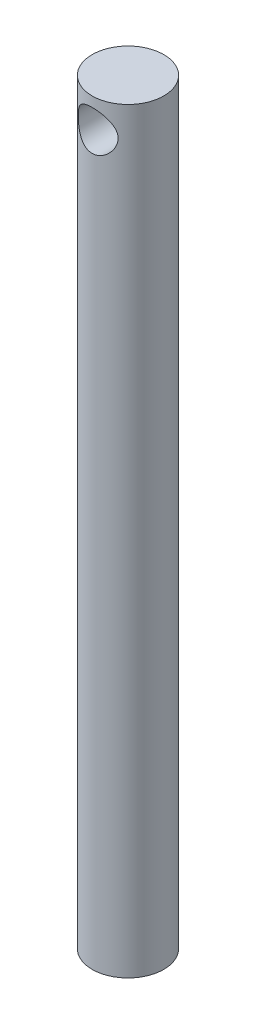
ISO-10303-21;
HEADER;
FILE_DESCRIPTION(('STEP AP214'),'2;1');
FILE_NAME('part.step','',(''),(''),'','','');
FILE_SCHEMA(('AUTOMOTIVE_DESIGN { 1 0 10303 214 1 1 1 1 }'));
ENDSEC;
DATA;
#1=APPLICATION_CONTEXT('core data for automotive mechanical design processes');
#2=APPLICATION_PROTOCOL_DEFINITION('international standard','automotive_design',2000,#1);
#3=PRODUCT_CONTEXT('',#1,'mechanical');
#4=PRODUCT('Part','Part','',(#3));
#5=PRODUCT_RELATED_PRODUCT_CATEGORY('part','',(#4));
#6=PRODUCT_DEFINITION_FORMATION('','',#4);
#7=PRODUCT_DEFINITION_CONTEXT('part definition',#1,'design');
#8=PRODUCT_DEFINITION('design','',#6,#7);
#9=PRODUCT_DEFINITION_SHAPE('','',#8);
#10=(LENGTH_UNIT() NAMED_UNIT(*) SI_UNIT(.MILLI.,.METRE.));
#11=(NAMED_UNIT(*) PLANE_ANGLE_UNIT() SI_UNIT($,.RADIAN.));
#12=(NAMED_UNIT(*) SI_UNIT($,.STERADIAN.) SOLID_ANGLE_UNIT());
#13=UNCERTAINTY_MEASURE_WITH_UNIT(LENGTH_MEASURE(1.E-05),#10,'distance_accuracy_value','');
#14=(GEOMETRIC_REPRESENTATION_CONTEXT(3) GLOBAL_UNCERTAINTY_ASSIGNED_CONTEXT((#13)) GLOBAL_UNIT_ASSIGNED_CONTEXT((#10,
#11,#12)) REPRESENTATION_CONTEXT('',''));
#15=CARTESIAN_POINT('',(0.,0.,0.));
#16=DIRECTION('',(0.,0.,1.));
#17=DIRECTION('',(1.,0.,0.));
#18=AXIS2_PLACEMENT_3D('',#15,#16,#17);
#19=CARTESIAN_POINT('',(0.,19.,0.));
#20=DIRECTION('',(0.,-1.,0.));
#21=DIRECTION('',(0.,0.,-1.));
#22=AXIS2_PLACEMENT_3D('',#19,#20,#21);
#23=CYLINDRICAL_SURFACE('',#22,0.900000000000012);
#24=CARTESIAN_POINT('',(0.,18.75,-0.900000000000012));
#25=CARTESIAN_POINT('',(-0.0259516180415343,18.7500007330382,-0.900000628930678));
#26=CARTESIAN_POINT('',(-0.0518990096092914,18.7479706859286,-0.898867939800679));
#27=CARTESIAN_POINT('',(-0.102987218847831,18.7399616277056,-0.894455861524972));
#28=CARTESIAN_POINT('',(-0.128127885923484,18.7339818837287,-0.891176073987617));
#29=CARTESIAN_POINT('',(-0.176817467388315,18.7183879685869,-0.882804854119521));
#30=CARTESIAN_POINT('',(-0.200371859199662,18.7087871491755,-0.877720081195732));
#31=CARTESIAN_POINT('',(-0.245491943516043,18.6863136662272,-0.866185154140367));
#32=CARTESIAN_POINT('',(-0.267057156471929,18.6734402165229,-0.859734671993746));
#33=CARTESIAN_POINT('',(-0.309267230287189,18.6437826634994,-0.845507962875407));
#34=CARTESIAN_POINT('',(-0.329743811112205,18.6267888704522,-0.837670737642017));
#35=CARTESIAN_POINT('',(-0.367717605518541,18.5898334665266,-0.821710946911043));
#36=CARTESIAN_POINT('',(-0.385211776235863,18.5698688630434,-0.813588100071374));
#37=CARTESIAN_POINT('',(-0.418514127804478,18.5251369579537,-0.797010492790095));
#38=CARTESIAN_POINT('',(-0.433971764269262,18.5000879797586,-0.78860552238546));
#39=CARTESIAN_POINT('',(-0.460387365230338,18.4472617217451,-0.773483381238847));
#40=CARTESIAN_POINT('',(-0.471351771633704,18.419488419123,-0.766763799572897));
#41=CARTESIAN_POINT('',(-0.486456439664131,18.3679885554105,-0.757246603523085));
#42=CARTESIAN_POINT('',(-0.491546556469881,18.3446380642815,-0.753921553430506));
#43=CARTESIAN_POINT('',(-0.498335741881583,18.2972528721768,-0.749452330150346));
#44=CARTESIAN_POINT('',(-0.500038153151307,18.2732188694056,-0.74830600725337));
#45=CARTESIAN_POINT('',(-0.499960490469495,18.2251337809655,-0.748357853700245));
#46=CARTESIAN_POINT('',(-0.498176603081155,18.2010827053886,-0.749558590341111));
#47=CARTESIAN_POINT('',(-0.491220895828952,18.1536844123199,-0.754134393037082));
#48=CARTESIAN_POINT('',(-0.48604687296249,18.1303376628449,-0.757510872925936));
#49=CARTESIAN_POINT('',(-0.472555301418685,18.0849135504014,-0.765998848384331));
#50=CARTESIAN_POINT('',(-0.464237053839237,18.0628364709146,-0.771110729675259));
#51=CARTESIAN_POINT('',(-0.444740513687482,18.020318495229,-0.782517212243445));
#52=CARTESIAN_POINT('',(-0.433561104053154,17.9998782421855,-0.788812275205895));
#53=CARTESIAN_POINT('',(-0.406692869874867,17.9579173409322,-0.803034993047096));
#54=CARTESIAN_POINT('',(-0.390576941221375,17.9367045493165,-0.811065370336516));
#55=CARTESIAN_POINT('',(-0.355193650405672,17.8970926094734,-0.8271733869563));
#56=CARTESIAN_POINT('',(-0.335923801219949,17.8786957040479,-0.835251058694262));
#57=CARTESIAN_POINT('',(-0.292427800338656,17.8433702099389,-0.851514818228229));
#58=CARTESIAN_POINT('',(-0.267897232214284,17.8267795615757,-0.859628875490425));
#59=CARTESIAN_POINT('',(-0.215895605224795,17.7980378902513,-0.874137110118378));
#60=CARTESIAN_POINT('',(-0.188426497424163,17.7858839448767,-0.880532418872081));
#61=CARTESIAN_POINT('',(-0.133349605231109,17.7672978328295,-0.890474186977822));
#62=CARTESIAN_POINT('',(-0.105889776866128,17.7605210461218,-0.894190501906473));
#63=CARTESIAN_POINT('',(-0.050004837393453,17.7517052589511,-0.899045922448039));
#64=CARTESIAN_POINT('',(-0.0215806013930791,17.7496620740019,-0.900187304268714));
#65=CARTESIAN_POINT('',(0.0319473984122735,17.7503866437694,-0.899785582834265));
#66=CARTESIAN_POINT('',(0.057062351142783,17.7526353496919,-0.898532090119897));
#67=CARTESIAN_POINT('',(0.106492277868426,17.760830371462,-0.894021921161971));
#68=CARTESIAN_POINT('',(0.130807225840485,17.7667768074668,-0.890765179823175));
#69=CARTESIAN_POINT('',(0.177925208429504,17.7820742620773,-0.882560589946018));
#70=CARTESIAN_POINT('',(0.200733455023635,17.7914127296877,-0.877618979741515));
#71=CARTESIAN_POINT('',(0.244484897719614,17.81316523647,-0.866451150384859));
#72=CARTESIAN_POINT('',(0.265427592692708,17.8255800986633,-0.860224587546634));
#73=CARTESIAN_POINT('',(0.307174164204761,17.8545824383674,-0.846272368438556));
#74=CARTESIAN_POINT('',(0.327741107415352,17.8714681504376,-0.838458341161742));
#75=CARTESIAN_POINT('',(0.365907827931709,17.9082186146433,-0.822520634436391));
#76=CARTESIAN_POINT('',(0.383504298861072,17.9280866404855,-0.814396622116304));
#77=CARTESIAN_POINT('',(0.417023922940649,17.9726123295229,-0.797793724674673));
#78=CARTESIAN_POINT('',(0.43260003136163,17.9975508535049,-0.789361511064956));
#79=CARTESIAN_POINT('',(0.459275865215219,18.0501689316759,-0.774146525586693));
#80=CARTESIAN_POINT('',(0.470381921883481,18.0778445393956,-0.767361426247265));
#81=CARTESIAN_POINT('',(0.485777779535463,18.1292433940221,-0.757683808943428));
#82=CARTESIAN_POINT('',(0.491005772279786,18.1525882544672,-0.754274744866485));
#83=CARTESIAN_POINT('',(0.498067851443076,18.1999893274686,-0.74963129117375));
#84=CARTESIAN_POINT('',(0.499905327967984,18.2240448050082,-0.748394729377859));
#85=CARTESIAN_POINT('',(0.500087638183557,18.2722043514262,-0.748272924998949));
#86=CARTESIAN_POINT('',(0.498428123808987,18.2963084435245,-0.749390609622431));
#87=CARTESIAN_POINT('',(0.491703286346536,18.3438335970539,-0.753819219296736));
#88=CARTESIAN_POINT('',(0.486635788424918,18.3672542123542,-0.757131544856387));
#89=CARTESIAN_POINT('',(0.473358966411316,18.412763773084,-0.765501068763513));
#90=CARTESIAN_POINT('',(0.465159134534052,18.43485651067,-0.77055299092753));
#91=CARTESIAN_POINT('',(0.44589888404248,18.4774216567041,-0.781855874975331));
#92=CARTESIAN_POINT('',(0.434837363493264,18.4978934370041,-0.788107298504518));
#93=CARTESIAN_POINT('',(0.408238525096982,18.5399124585152,-0.802247177989202));
#94=CARTESIAN_POINT('',(0.392277925010953,18.5611568825993,-0.810240363541065));
#95=CARTESIAN_POINT('',(0.357211862066317,18.600859023607,-0.826300213521401));
#96=CARTESIAN_POINT('',(0.338103858738676,18.6193144661014,-0.834366932293328));
#97=CARTESIAN_POINT('',(0.294895732493419,18.6548425295736,-0.850660243530043));
#98=CARTESIAN_POINT('',(0.270482985849602,18.6715711291572,-0.85881604053859));
#99=CARTESIAN_POINT('',(0.218698282732607,18.7006110129616,-0.873437315437358));
#100=CARTESIAN_POINT('',(0.19132850421679,18.7129255198379,-0.879904025562093));
#101=CARTESIAN_POINT('',(0.136964645521405,18.7316542876011,-0.889906816436148));
#102=CARTESIAN_POINT('',(0.110159322102965,18.7385005296275,-0.893654612287475));
#103=CARTESIAN_POINT('',(0.0555671937905213,18.7476712222809,-0.898699907664089));
#104=CARTESIAN_POINT('',(0.0277811751942199,18.7499992152835,-0.899999326730508));
#105=CARTESIAN_POINT('',(0.,18.75,-0.900000000000012));
#106=B_SPLINE_CURVE_WITH_KNOTS('',3,(#24,#25,#26,#27,#28,#29,#30,#31,#32,#33,#34,#35,#36,#37,
#38,#39,#40,#41,#42,#43,#44,#45,#46,#47,#48,#49,#50,#51,#52,#53,#54,#55,#56,#57,#58,#59,#60,#61,
#62,#63,#64,#65,#66,#67,#68,#69,#70,#71,#72,#73,#74,#75,#76,#77,#78,#79,#80,#81,#82,#83,#84,#85,
#86,#87,#88,#89,#90,#91,#92,#93,#94,#95,#96,#97,#98,#99,#100,#101,#102,#103,#104,#105),
.UNSPECIFIED.,.T.,.F.,(4,2,2,2,2,2,2,2,2,2,2,2,2,2,2,2,2,2,2,2,2,2,2,2,2,2,2,2,2,2,2,2,2,2,2,2,
2,2,2,2,4),(0.,0.0777471101814677,0.155508650340402,0.232986224956097,0.310482429231776,
0.393367589903566,0.476336816203388,0.567714534273788,0.658960782624357,0.73103235329843,
0.803032775309457,0.875111998010331,0.947238106273613,1.01938025625316,1.09155061523244,
1.17468840888892,1.25789207951703,1.34953095001767,1.44110934949596,1.52619388992338,
1.61120318718997,1.68657707013311,1.76195340246768,1.83705362643423,1.91217396354075,
1.99503935011701,2.07799637295701,2.1693088341232,2.26049150428246,2.33267060799347,
2.40477750214555,2.47697410498497,2.54921682447574,2.62124233463868,2.6932956206614,
2.77620684081303,2.85918531480231,2.95080298412446,3.04235362801527,3.12564714363869,
3.20887532946274),.UNSPECIFIED.);
#107=CARTESIAN_POINT('',(0.,18.75,-0.900000000000012));
#108=VERTEX_POINT('',#107);
#109=EDGE_CURVE('E10',#108,#108,#106,.T.);
#110=ORIENTED_EDGE('',*,*,#109,.T.);
#111=EDGE_LOOP('',(#110));
#112=FACE_BOUND('',#111,.T.);
#113=CARTESIAN_POINT('',(0.500000000000001,18.25,0.748331477354802));
#114=CARTESIAN_POINT('',(0.499998076678242,18.2244257647542,0.74833418997054));
#115=CARTESIAN_POINT('',(0.498024183914054,18.1988304049753,0.749663316823993));
#116=CARTESIAN_POINT('',(0.490247576770794,18.1484642094162,0.754769773051233));
#117=CARTESIAN_POINT('',(0.484438567686849,18.1236947996284,0.758551127166683));
#118=CARTESIAN_POINT('',(0.469345061412691,18.0758109264881,0.767979842979285));
#119=CARTESIAN_POINT('',(0.460082634322315,18.0526870412818,0.773615328963745));
#120=CARTESIAN_POINT('',(0.438413151167796,18.0083308133616,0.786097890270394));
#121=CARTESIAN_POINT('',(0.426005396633576,17.9870988922056,0.792945234602964));
#122=CARTESIAN_POINT('',(0.396899694333041,17.9447166527276,0.807938804767508));
#123=CARTESIAN_POINT('',(0.379890988471879,17.923801283277,0.81614613894483));
#124=CARTESIAN_POINT('',(0.342707501678033,17.8849307350275,0.832444599494491));
#125=CARTESIAN_POINT('',(0.322530796539209,17.8669773689959,0.840535651957047));
#126=CARTESIAN_POINT('',(0.277419704736604,17.8329820331422,0.856539281112792));
#127=CARTESIAN_POINT('',(0.252222739360588,17.8172479339157,0.864373293540685));
#128=CARTESIAN_POINT('',(0.199021686171326,17.7903516674686,0.878147429983966));
#129=CARTESIAN_POINT('',(0.171019801939079,17.7791859457975,0.88408902560385));
#130=CARTESIAN_POINT('',(0.115508490947768,17.7627388621754,0.892961245772501));
#131=CARTESIAN_POINT('',(0.0881575182920551,17.757039878824,0.89610393266566));
#132=CARTESIAN_POINT('',(0.0327233879994672,17.7502931030393,0.899832538873036));
#133=CARTESIAN_POINT('',(0.00464081639720638,17.7492416963903,0.90042044492185));
#134=CARTESIAN_POINT('',(-0.0482357814852657,17.7517046973258,0.899053905848299));
#135=CARTESIAN_POINT('',(-0.0730607668388573,17.7547435630614,0.897364225416982));
#136=CARTESIAN_POINT('',(-0.121781296833954,17.7644218075333,0.892059304736737));
#137=CARTESIAN_POINT('',(-0.145676769678483,17.7710614638107,0.888443916058796));
#138=CARTESIAN_POINT('',(-0.192195921872571,17.7877466751896,0.879561207631123));
#139=CARTESIAN_POINT('',(-0.214803947541814,17.797826642106,0.874277239438389));
#140=CARTESIAN_POINT('',(-0.258050152572976,17.8210326197579,0.862503978931832));
#141=CARTESIAN_POINT('',(-0.27868771029456,17.8341595873049,0.856014308134363));
#142=CARTESIAN_POINT('',(-0.319819105775965,17.8647182916816,0.841570638592023));
#143=CARTESIAN_POINT('',(-0.340050960874663,17.8824636345851,0.833534120285175));
#144=CARTESIAN_POINT('',(-0.377407647729188,17.9209352264284,0.81729995597867));
#145=CARTESIAN_POINT('',(-0.394529150933721,17.9416646267517,0.809102147647589));
#146=CARTESIAN_POINT('',(-0.426731995848817,17.9877777145569,0.792625843826844));
#147=CARTESIAN_POINT('',(-0.44148730536992,18.0134130399254,0.78440750737356));
#148=CARTESIAN_POINT('',(-0.466380074398445,18.0673294900505,0.769869436914114));
#149=CARTESIAN_POINT('',(-0.476522884439481,18.0956075031091,0.763547505977212));
#150=CARTESIAN_POINT('',(-0.491020562051992,18.1516758310009,0.754299644874158));
#151=CARTESIAN_POINT('',(-0.495775452088934,18.1793223319632,0.751141406770435));
#152=CARTESIAN_POINT('',(-0.500563506735043,18.2351868235552,0.74796121659111));
#153=CARTESIAN_POINT('',(-0.500602380891588,18.2634040817685,0.747935472093762));
#154=CARTESIAN_POINT('',(-0.496323018171831,18.3150601544313,0.750777533106593));
#155=CARTESIAN_POINT('',(-0.492656392047105,18.3385817627198,0.753212603418392));
#156=CARTESIAN_POINT('',(-0.482118715748021,18.3846075949835,0.760000365478963));
#157=CARTESIAN_POINT('',(-0.475246201462029,18.4071113489537,0.764353933344792));
#158=CARTESIAN_POINT('',(-0.458222179908323,18.4515497063881,0.774683715078896));
#159=CARTESIAN_POINT('',(-0.447947115621188,18.4734225474942,0.780719451766145));
#160=CARTESIAN_POINT('',(-0.424511872267633,18.5152647912496,0.79370594008193));
#161=CARTESIAN_POINT('',(-0.411350284927552,18.5352332579477,0.800657137680891));
#162=CARTESIAN_POINT('',(-0.380033742532593,18.5760982457974,0.816042590049878));
#163=CARTESIAN_POINT('',(-0.361415057417175,18.5966193975605,0.824534441841475));
#164=CARTESIAN_POINT('',(-0.320941796343527,18.6343998391743,0.84111531890235));
#165=CARTESIAN_POINT('',(-0.299085235549781,18.6516571133721,0.849204092989355));
#166=CARTESIAN_POINT('',(-0.251252086643194,18.6832865978029,0.864601748962311));
#167=CARTESIAN_POINT('',(-0.225117094748039,18.6974536178052,0.87184525194792));
#168=CARTESIAN_POINT('',(-0.170320432777582,18.7210392600739,0.884181276325733));
#169=CARTESIAN_POINT('',(-0.141661467187871,18.730462893952,0.889276067007159));
#170=CARTESIAN_POINT('',(-0.0857980219267809,18.7433295566077,0.896297039715773));
#171=CARTESIAN_POINT('',(-0.0587465348286958,18.7472874853728,0.898494946548119));
#172=CARTESIAN_POINT('',(-0.00427821790070385,18.7507244793918,0.900401349033511));
#173=CARTESIAN_POINT('',(0.0231384022769568,18.7502060128325,0.900111216537878));
#174=CARTESIAN_POINT('',(0.0748674915760803,18.7449828775235,0.897220350747554));
#175=CARTESIAN_POINT('',(0.0992331461581856,18.7406684807815,0.894835064217375));
#176=CARTESIAN_POINT('',(0.146833432970224,18.7285844473483,0.888266514130581));
#177=CARTESIAN_POINT('',(0.170067932479494,18.7208144062784,0.884083040152374));
#178=CARTESIAN_POINT('',(0.215629543681866,18.7018112599579,0.874108660552551));
#179=CARTESIAN_POINT('',(0.237901766668261,18.690472767994,0.868269460822671));
#180=CARTESIAN_POINT('',(0.280297820843562,18.6647869516404,0.855525535185053));
#181=CARTESIAN_POINT('',(0.300420800610247,18.6504384414556,0.848620389632516));
#182=CARTESIAN_POINT('',(0.340435712853912,18.6172275903057,0.83343442803194));
#183=CARTESIAN_POINT('',(0.360028019343631,18.5980342261525,0.825087045567083));
#184=CARTESIAN_POINT('',(0.395866970387619,18.5566586530399,0.808504937300917));
#185=CARTESIAN_POINT('',(0.412109415036099,18.5344727490903,0.800270364860459));
#186=CARTESIAN_POINT('',(0.441887718701204,18.4858086350326,0.784245400421351));
#187=CARTESIAN_POINT('',(0.455151086374981,18.4591378668979,0.776527555703625));
#188=CARTESIAN_POINT('',(0.476818931293876,18.4033975408191,0.763417854647289));
#189=CARTESIAN_POINT('',(0.485238708964762,18.3743358717374,0.758018687685723));
#190=CARTESIAN_POINT('',(0.493960808491355,18.3290770292903,0.752339239966521));
#191=CARTESIAN_POINT('',(0.496219555020326,18.3133873499681,0.750845808940839));
#192=CARTESIAN_POINT('',(0.49923970932887,18.281801163181,0.748841110057043));
#193=CARTESIAN_POINT('',(0.500001196117545,18.2659046666742,0.748329790373795));
#194=CARTESIAN_POINT('',(0.500000000000001,18.25,0.748331477354802));
#195=B_SPLINE_CURVE_WITH_KNOTS('',3,(#113,#114,#115,#116,#117,#118,#119,#120,#121,#122,#123,
#124,#125,#126,#127,#128,#129,#130,#131,#132,#133,#134,#135,#136,#137,#138,#139,#140,#141,#142,
#143,#144,#145,#146,#147,#148,#149,#150,#151,#152,#153,#154,#155,#156,#157,#158,#159,#160,#161,
#162,#163,#164,#165,#166,#167,#168,#169,#170,#171,#172,#173,#174,#175,#176,#177,#178,#179,#180,
#181,#182,#183,#184,#185,#186,#187,#188,#189,#190,#191,#192,#193,#194),.UNSPECIFIED.,.T.,.F.,(4,
2,2,2,2,2,2,2,2,2,2,2,2,2,2,2,2,2,2,2,2,2,2,2,2,2,2,2,2,2,2,2,2,2,2,2,2,2,2,2,4),(0.,
0.0766550766242663,0.153436283633152,0.22973498146871,0.306050637511163,0.390248945907943,
0.474498594641376,0.566172788210106,0.657775517916427,0.741635088643401,0.825429433987295,
0.900276367558367,0.975129070988126,1.05075356915853,1.12640184694573,1.2103140551684,
1.29431553996184,1.38593823909496,1.47745438239586,1.56160741745414,1.64565856978903,
1.71712296283992,1.7886200252901,1.86306614572964,1.93754866797914,2.02411966944439,
2.11074396070164,2.20202907075501,2.29321753025844,2.37503900417677,2.45681536639788,
2.53105391967705,2.60530116262267,2.68198767598153,2.7587044568781,2.84435242304422,
2.93010712660106,3.02192379711458,3.11344881217188,3.16112326932476,3.20879521067017),.UNSPECIFIED.);
#196=CARTESIAN_POINT('',(0.500000000000001,18.25,0.748331477354802));
#197=VERTEX_POINT('',#196);
#198=EDGE_CURVE('E41',#197,#197,#195,.T.);
#199=ORIENTED_EDGE('',*,*,#198,.T.);
#200=EDGE_LOOP('',(#199));
#201=FACE_BOUND('',#200,.T.);
#202=CARTESIAN_POINT('',(0.,19.,0.));
#203=DIRECTION('',(0.,1.,0.));
#204=DIRECTION('',(0.,0.,1.));
#205=AXIS2_PLACEMENT_3D('',#202,#203,#204);
#206=CIRCLE('',#205,0.900000000000012);
#207=CARTESIAN_POINT('',(0.,19.,0.900000000000012));
#208=VERTEX_POINT('',#207);
#209=EDGE_CURVE('E45',#208,#208,#206,.T.);
#210=ORIENTED_EDGE('',*,*,#209,.F.);
#211=EDGE_LOOP('',(#210));
#212=FACE_BOUND('',#211,.T.);
#213=CARTESIAN_POINT('',(0.,0.,0.));
#214=DIRECTION('',(0.,1.,0.));
#215=DIRECTION('',(0.,0.,1.));
#216=AXIS2_PLACEMENT_3D('',#213,#214,#215);
#217=CIRCLE('',#216,0.900000000000012);
#218=CARTESIAN_POINT('',(0.,0.,0.900000000000012));
#219=VERTEX_POINT('',#218);
#220=EDGE_CURVE('E49',#219,#219,#217,.T.);
#221=ORIENTED_EDGE('',*,*,#220,.T.);
#222=EDGE_LOOP('',(#221));
#223=FACE_BOUND('',#222,.T.);
#224=ADVANCED_FACE('F31',(#112,#201,#212,#223),#23,.T.);
#225=CARTESIAN_POINT('',(0.,19.,0.));
#226=DIRECTION('',(0.,1.,0.));
#227=DIRECTION('',(0.,0.,1.));
#228=AXIS2_PLACEMENT_3D('',#225,#226,#227);
#229=PLANE('',#228);
#230=ORIENTED_EDGE('',*,*,#209,.T.);
#231=EDGE_LOOP('',(#230));
#232=FACE_BOUND('',#231,.T.);
#233=ADVANCED_FACE('F60',(#232),#229,.T.);
#234=CARTESIAN_POINT('',(0.,0.,0.));
#235=DIRECTION('',(0.,1.,0.));
#236=DIRECTION('',(0.,0.,1.));
#237=AXIS2_PLACEMENT_3D('',#234,#235,#236);
#238=PLANE('',#237);
#239=ORIENTED_EDGE('',*,*,#220,.F.);
#240=EDGE_LOOP('',(#239));
#241=FACE_BOUND('',#240,.T.);
#242=ADVANCED_FACE('F58',(#241),#238,.F.);
#243=CARTESIAN_POINT('',(0.,18.25,-0.900000000000012));
#244=DIRECTION('',(0.,0.,1.));
#245=DIRECTION('',(1.,0.,0.));
#246=AXIS2_PLACEMENT_3D('',#243,#244,#245);
#247=CYLINDRICAL_SURFACE('',#246,0.500000000000001);
#248=ORIENTED_EDGE('',*,*,#198,.F.);
#249=EDGE_LOOP('',(#248));
#250=FACE_BOUND('',#249,.T.);
#251=ORIENTED_EDGE('',*,*,#109,.F.);
#252=EDGE_LOOP('',(#251));
#253=FACE_BOUND('',#252,.T.);
#254=ADVANCED_FACE('F54',(#250,#253),#247,.F.);
#255=CLOSED_SHELL('',(#224,#233,#242,#254));
#256=MANIFOLD_SOLID_BREP('B2',#255);
#257=ADVANCED_BREP_SHAPE_REPRESENTATION('',(#18,#256),#14);
#258=SHAPE_DEFINITION_REPRESENTATION(#9,#257);
ENDSEC;
END-ISO-10303-21;
